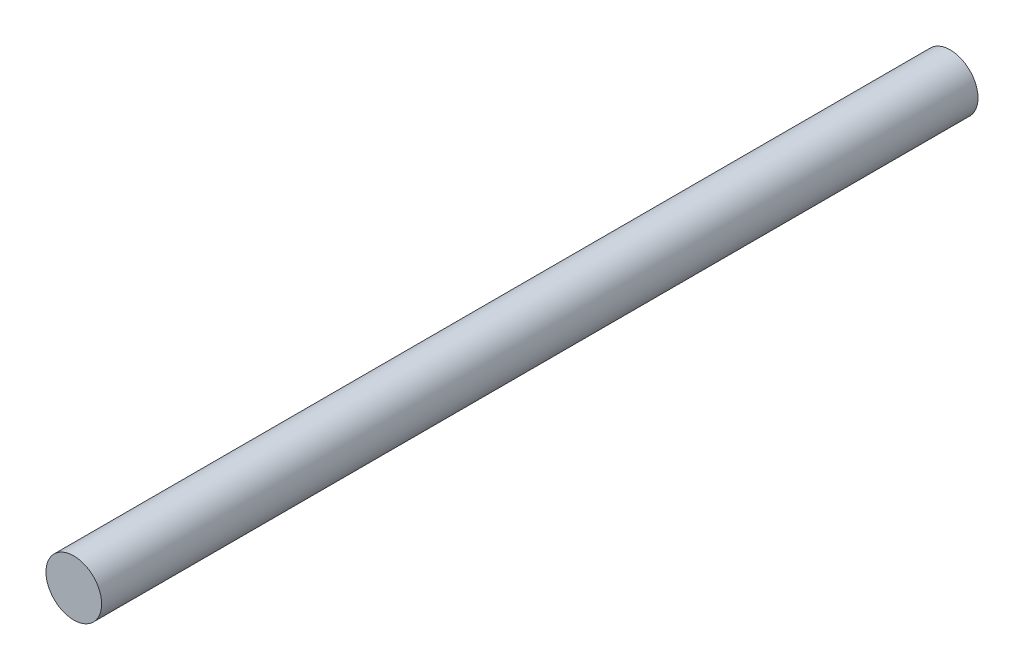
ISO-10303-21;
HEADER;
FILE_DESCRIPTION(('STEP AP214'),'2;1');
FILE_NAME('part.step','',(''),(''),'','','');
FILE_SCHEMA(('AUTOMOTIVE_DESIGN { 1 0 10303 214 1 1 1 1 }'));
ENDSEC;
DATA;
#1=APPLICATION_CONTEXT('core data for automotive mechanical design processes');
#2=APPLICATION_PROTOCOL_DEFINITION('international standard','automotive_design',2000,#1);
#3=PRODUCT_CONTEXT('',#1,'mechanical');
#4=PRODUCT('Part','Part','',(#3));
#5=PRODUCT_RELATED_PRODUCT_CATEGORY('part','',(#4));
#6=PRODUCT_DEFINITION_FORMATION('','',#4);
#7=PRODUCT_DEFINITION_CONTEXT('part definition',#1,'design');
#8=PRODUCT_DEFINITION('design','',#6,#7);
#9=PRODUCT_DEFINITION_SHAPE('','',#8);
#10=(LENGTH_UNIT() NAMED_UNIT(*) SI_UNIT(.MILLI.,.METRE.));
#11=(NAMED_UNIT(*) PLANE_ANGLE_UNIT() SI_UNIT($,.RADIAN.));
#12=(NAMED_UNIT(*) SI_UNIT($,.STERADIAN.) SOLID_ANGLE_UNIT());
#13=UNCERTAINTY_MEASURE_WITH_UNIT(LENGTH_MEASURE(1.E-05),#10,'distance_accuracy_value','');
#14=(GEOMETRIC_REPRESENTATION_CONTEXT(3) GLOBAL_UNCERTAINTY_ASSIGNED_CONTEXT((#13)) GLOBAL_UNIT_ASSIGNED_CONTEXT((#10,
#11,#12)) REPRESENTATION_CONTEXT('',''));
#15=CARTESIAN_POINT('',(0.,0.,0.));
#16=DIRECTION('',(0.,0.,1.));
#17=DIRECTION('',(1.,0.,0.));
#18=AXIS2_PLACEMENT_3D('',#15,#16,#17);
#19=CARTESIAN_POINT('',(0.,0.,126.));
#20=DIRECTION('',(0.,0.,-1.));
#21=DIRECTION('',(-1.,0.,0.));
#22=AXIS2_PLACEMENT_3D('',#19,#20,#21);
#23=CYLINDRICAL_SURFACE('',#22,4.);
#24=CARTESIAN_POINT('',(0.,0.,126.));
#25=DIRECTION('',(0.,0.,1.));
#26=DIRECTION('',(1.,0.,0.));
#27=AXIS2_PLACEMENT_3D('',#24,#25,#26);
#28=CIRCLE('',#27,4.);
#29=CARTESIAN_POINT('',(4.,0.,126.));
#30=VERTEX_POINT('',#29);
#31=EDGE_CURVE('E10',#30,#30,#28,.T.);
#32=ORIENTED_EDGE('',*,*,#31,.F.);
#33=EDGE_LOOP('',(#32));
#34=FACE_BOUND('',#33,.T.);
#35=CARTESIAN_POINT('',(0.,0.,0.));
#36=DIRECTION('',(0.,0.,1.));
#37=DIRECTION('',(1.,0.,0.));
#38=AXIS2_PLACEMENT_3D('',#35,#36,#37);
#39=CIRCLE('',#38,4.);
#40=CARTESIAN_POINT('',(4.,0.,0.));
#41=VERTEX_POINT('',#40);
#42=EDGE_CURVE('E37',#41,#41,#39,.T.);
#43=ORIENTED_EDGE('',*,*,#42,.T.);
#44=EDGE_LOOP('',(#43));
#45=FACE_BOUND('',#44,.T.);
#46=ADVANCED_FACE('F40',(#34,#45),#23,.T.);
#47=CARTESIAN_POINT('',(0.,0.,126.));
#48=DIRECTION('',(0.,0.,1.));
#49=DIRECTION('',(1.,0.,0.));
#50=AXIS2_PLACEMENT_3D('',#47,#48,#49);
#51=PLANE('',#50);
#52=ORIENTED_EDGE('',*,*,#31,.T.);
#53=EDGE_LOOP('',(#52));
#54=FACE_BOUND('',#53,.T.);
#55=ADVANCED_FACE('F55',(#54),#51,.T.);
#56=CARTESIAN_POINT('',(0.,0.,0.));
#57=DIRECTION('',(0.,0.,1.));
#58=DIRECTION('',(1.,0.,0.));
#59=AXIS2_PLACEMENT_3D('',#56,#57,#58);
#60=PLANE('',#59);
#61=ORIENTED_EDGE('',*,*,#42,.F.);
#62=EDGE_LOOP('',(#61));
#63=FACE_BOUND('',#62,.T.);
#64=ADVANCED_FACE('F49',(#63),#60,.F.);
#65=CLOSED_SHELL('',(#46,#55,#64));
#66=MANIFOLD_SOLID_BREP('B2',#65);
#67=ADVANCED_BREP_SHAPE_REPRESENTATION('',(#18,#66),#14);
#68=SHAPE_DEFINITION_REPRESENTATION(#9,#67);
ENDSEC;
END-ISO-10303-21;
